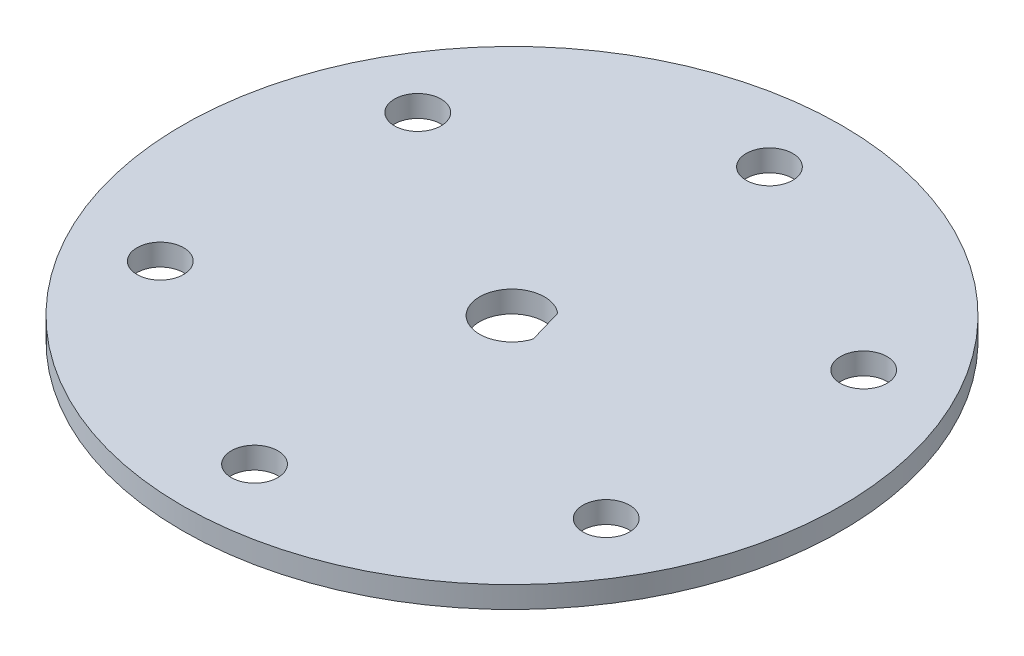
ISO-10303-21;
HEADER;
FILE_DESCRIPTION(('STEP AP214'),'2;1');
FILE_NAME('part.step','',(''),(''),'','','');
FILE_SCHEMA(('AUTOMOTIVE_DESIGN { 1 0 10303 214 1 1 1 1 }'));
ENDSEC;
DATA;
#1=APPLICATION_CONTEXT('core data for automotive mechanical design processes');
#2=APPLICATION_PROTOCOL_DEFINITION('international standard','automotive_design',2000,#1);
#3=PRODUCT_CONTEXT('',#1,'mechanical');
#4=PRODUCT('Part','Part','',(#3));
#5=PRODUCT_RELATED_PRODUCT_CATEGORY('part','',(#4));
#6=PRODUCT_DEFINITION_FORMATION('','',#4);
#7=PRODUCT_DEFINITION_CONTEXT('part definition',#1,'design');
#8=PRODUCT_DEFINITION('design','',#6,#7);
#9=PRODUCT_DEFINITION_SHAPE('','',#8);
#10=(LENGTH_UNIT() NAMED_UNIT(*) SI_UNIT(.MILLI.,.METRE.));
#11=(NAMED_UNIT(*) PLANE_ANGLE_UNIT() SI_UNIT($,.RADIAN.));
#12=(NAMED_UNIT(*) SI_UNIT($,.STERADIAN.) SOLID_ANGLE_UNIT());
#13=UNCERTAINTY_MEASURE_WITH_UNIT(LENGTH_MEASURE(1.E-05),#10,'distance_accuracy_value','');
#14=(GEOMETRIC_REPRESENTATION_CONTEXT(3) GLOBAL_UNCERTAINTY_ASSIGNED_CONTEXT((#13)) GLOBAL_UNIT_ASSIGNED_CONTEXT((#10,
#11,#12)) REPRESENTATION_CONTEXT('',''));
#15=CARTESIAN_POINT('',(0.,0.,0.));
#16=DIRECTION('',(0.,0.,1.));
#17=DIRECTION('',(1.,0.,0.));
#18=AXIS2_PLACEMENT_3D('',#15,#16,#17);
#19=CARTESIAN_POINT('',(0.,2.,0.));
#20=DIRECTION('',(0.,1.,0.));
#21=DIRECTION('',(0.,0.,1.));
#22=AXIS2_PLACEMENT_3D('',#19,#20,#21);
#23=PLANE('',#22);
#24=DIRECTION('',(-0.280870271353728,0.,-0.95974574272027));
#25=VECTOR('',#24,1.);
#26=CARTESIAN_POINT('',(2.39828920067989,2.,-0.701861033184085));
#27=LINE('',#26,#25);
#28=CARTESIAN_POINT('',(2.86453385112708,2.,0.891316899731563));
#29=VERTEX_POINT('',#28);
#30=CARTESIAN_POINT('',(1.9320445502327,2.,-2.29503896609973));
#31=VERTEX_POINT('',#30);
#32=EDGE_CURVE('E50',#29,#31,#27,.T.);
#33=ORIENTED_EDGE('',*,*,#32,.F.);
#34=CARTESIAN_POINT('',(0.,2.,0.));
#35=DIRECTION('',(0.,1.,0.));
#36=DIRECTION('',(0.,0.,1.));
#37=AXIS2_PLACEMENT_3D('',#34,#35,#36);
#38=CIRCLE('',#37,3.);
#39=EDGE_CURVE('E68',#31,#29,#38,.T.);
#40=ORIENTED_EDGE('',*,*,#39,.F.);
#41=EDGE_LOOP('',(#33,#40));
#42=FACE_BOUND('',#41,.T.);
#43=CARTESIAN_POINT('',(-20.6222299276169,2.,-11.90625));
#44=DIRECTION('',(0.,1.,0.));
#45=DIRECTION('',(0.,0.,1.));
#46=AXIS2_PLACEMENT_3D('',#43,#44,#45);
#47=CIRCLE('',#46,2.15265);
#48=CARTESIAN_POINT('',(-20.6222299276169,2.,-9.7536));
#49=VERTEX_POINT('',#48);
#50=EDGE_CURVE('E82',#49,#49,#47,.T.);
#51=ORIENTED_EDGE('',*,*,#50,.F.);
#52=EDGE_LOOP('',(#51));
#53=FACE_BOUND('',#52,.T.);
#54=CARTESIAN_POINT('',(20.6222299276168,2.,-11.9062500000002));
#55=DIRECTION('',(0.,1.,0.));
#56=DIRECTION('',(0.,0.,1.));
#57=AXIS2_PLACEMENT_3D('',#54,#55,#56);
#58=CIRCLE('',#57,2.15265);
#59=CARTESIAN_POINT('',(20.6222299276168,2.,-9.75360000000024));
#60=VERTEX_POINT('',#59);
#61=EDGE_CURVE('E94',#60,#60,#58,.T.);
#62=ORIENTED_EDGE('',*,*,#61,.F.);
#63=EDGE_LOOP('',(#62));
#64=FACE_BOUND('',#63,.T.);
#65=CARTESIAN_POINT('',(0.,2.,23.8125));
#66=DIRECTION('',(0.,1.,0.));
#67=DIRECTION('',(0.,0.,1.));
#68=AXIS2_PLACEMENT_3D('',#65,#66,#67);
#69=CIRCLE('',#68,2.15265);
#70=CARTESIAN_POINT('',(0.,2.,25.96515));
#71=VERTEX_POINT('',#70);
#72=EDGE_CURVE('E106',#71,#71,#69,.T.);
#73=ORIENTED_EDGE('',*,*,#72,.F.);
#74=EDGE_LOOP('',(#73));
#75=FACE_BOUND('',#74,.T.);
#76=CARTESIAN_POINT('',(0.,2.,0.));
#77=DIRECTION('',(0.,1.,0.));
#78=DIRECTION('',(0.,0.,1.));
#79=AXIS2_PLACEMENT_3D('',#76,#77,#78);
#80=CIRCLE('',#79,30.48);
#81=CARTESIAN_POINT('',(0.,2.,30.48));
#82=VERTEX_POINT('',#81);
#83=EDGE_CURVE('E112',#82,#82,#80,.T.);
#84=ORIENTED_EDGE('',*,*,#83,.T.);
#85=EDGE_LOOP('',(#84));
#86=FACE_BOUND('',#85,.T.);
#87=CARTESIAN_POINT('',(20.622229927617,2.,11.9062499999998));
#88=DIRECTION('',(0.,1.,0.));
#89=DIRECTION('',(0.,0.,1.));
#90=AXIS2_PLACEMENT_3D('',#87,#88,#89);
#91=CIRCLE('',#90,2.15265);
#92=CARTESIAN_POINT('',(20.622229927617,2.,14.0588999999998));
#93=VERTEX_POINT('',#92);
#94=EDGE_CURVE('E100',#93,#93,#91,.T.);
#95=ORIENTED_EDGE('',*,*,#94,.F.);
#96=EDGE_LOOP('',(#95));
#97=FACE_BOUND('',#96,.T.);
#98=CARTESIAN_POINT('',(0.,2.,-23.8125));
#99=DIRECTION('',(0.,1.,0.));
#100=DIRECTION('',(0.,0.,1.));
#101=AXIS2_PLACEMENT_3D('',#98,#99,#100);
#102=CIRCLE('',#101,2.15265);
#103=CARTESIAN_POINT('',(0.,2.,-21.65985));
#104=VERTEX_POINT('',#103);
#105=EDGE_CURVE('E88',#104,#104,#102,.T.);
#106=ORIENTED_EDGE('',*,*,#105,.F.);
#107=EDGE_LOOP('',(#106));
#108=FACE_BOUND('',#107,.T.);
#109=CARTESIAN_POINT('',(-20.6222299276169,2.,11.90625));
#110=DIRECTION('',(0.,1.,0.));
#111=DIRECTION('',(0.,0.,1.));
#112=AXIS2_PLACEMENT_3D('',#109,#110,#111);
#113=CIRCLE('',#112,2.15265);
#114=CARTESIAN_POINT('',(-20.6222299276169,2.,14.0589));
#115=VERTEX_POINT('',#114);
#116=EDGE_CURVE('E76',#115,#115,#113,.T.);
#117=ORIENTED_EDGE('',*,*,#116,.F.);
#118=EDGE_LOOP('',(#117));
#119=FACE_BOUND('',#118,.T.);
#120=ADVANCED_FACE('F35',(#42,#53,#64,#75,#86,#97,#108,#119),#23,.T.);
#121=CARTESIAN_POINT('',(0.,0.,0.));
#122=DIRECTION('',(0.,1.,0.));
#123=DIRECTION('',(0.,0.,1.));
#124=AXIS2_PLACEMENT_3D('',#121,#122,#123);
#125=PLANE('',#124);
#126=CARTESIAN_POINT('',(0.,0.,0.));
#127=DIRECTION('',(0.,1.,0.));
#128=DIRECTION('',(0.,0.,1.));
#129=AXIS2_PLACEMENT_3D('',#126,#127,#128);
#130=CIRCLE('',#129,3.);
#131=CARTESIAN_POINT('',(1.9320445502327,0.,-2.29503896609973));
#132=VERTEX_POINT('',#131);
#133=CARTESIAN_POINT('',(2.86453385112708,0.,0.891316899731563));
#134=VERTEX_POINT('',#133);
#135=EDGE_CURVE('E43',#132,#134,#130,.T.);
#136=ORIENTED_EDGE('',*,*,#135,.T.);
#137=DIRECTION('',(-0.280870271353728,0.,-0.95974574272027));
#138=VECTOR('',#137,1.);
#139=CARTESIAN_POINT('',(2.39828920067989,0.,-0.701861033184085));
#140=LINE('',#139,#138);
#141=EDGE_CURVE('E11',#134,#132,#140,.T.);
#142=ORIENTED_EDGE('',*,*,#141,.T.);
#143=EDGE_LOOP('',(#136,#142));
#144=FACE_BOUND('',#143,.T.);
#145=CARTESIAN_POINT('',(0.,0.,0.));
#146=DIRECTION('',(0.,1.,0.));
#147=DIRECTION('',(0.,0.,1.));
#148=AXIS2_PLACEMENT_3D('',#145,#146,#147);
#149=CIRCLE('',#148,30.48);
#150=CARTESIAN_POINT('',(0.,0.,30.48));
#151=VERTEX_POINT('',#150);
#152=EDGE_CURVE('E109',#151,#151,#149,.T.);
#153=ORIENTED_EDGE('',*,*,#152,.F.);
#154=EDGE_LOOP('',(#153));
#155=FACE_BOUND('',#154,.T.);
#156=CARTESIAN_POINT('',(0.,0.,23.8125));
#157=DIRECTION('',(0.,1.,0.));
#158=DIRECTION('',(0.,0.,1.));
#159=AXIS2_PLACEMENT_3D('',#156,#157,#158);
#160=CIRCLE('',#159,2.15265);
#161=CARTESIAN_POINT('',(0.,0.,25.96515));
#162=VERTEX_POINT('',#161);
#163=EDGE_CURVE('E103',#162,#162,#160,.T.);
#164=ORIENTED_EDGE('',*,*,#163,.T.);
#165=EDGE_LOOP('',(#164));
#166=FACE_BOUND('',#165,.T.);
#167=CARTESIAN_POINT('',(20.622229927617,0.,11.9062499999998));
#168=DIRECTION('',(0.,1.,0.));
#169=DIRECTION('',(0.,0.,1.));
#170=AXIS2_PLACEMENT_3D('',#167,#168,#169);
#171=CIRCLE('',#170,2.15265);
#172=CARTESIAN_POINT('',(20.622229927617,0.,14.0588999999998));
#173=VERTEX_POINT('',#172);
#174=EDGE_CURVE('E97',#173,#173,#171,.T.);
#175=ORIENTED_EDGE('',*,*,#174,.T.);
#176=EDGE_LOOP('',(#175));
#177=FACE_BOUND('',#176,.T.);
#178=CARTESIAN_POINT('',(20.6222299276168,0.,-11.9062500000002));
#179=DIRECTION('',(0.,1.,0.));
#180=DIRECTION('',(0.,0.,1.));
#181=AXIS2_PLACEMENT_3D('',#178,#179,#180);
#182=CIRCLE('',#181,2.15265);
#183=CARTESIAN_POINT('',(20.6222299276168,0.,-9.75360000000024));
#184=VERTEX_POINT('',#183);
#185=EDGE_CURVE('E91',#184,#184,#182,.T.);
#186=ORIENTED_EDGE('',*,*,#185,.T.);
#187=EDGE_LOOP('',(#186));
#188=FACE_BOUND('',#187,.T.);
#189=CARTESIAN_POINT('',(0.,0.,-23.8125));
#190=DIRECTION('',(0.,1.,0.));
#191=DIRECTION('',(0.,0.,1.));
#192=AXIS2_PLACEMENT_3D('',#189,#190,#191);
#193=CIRCLE('',#192,2.15265);
#194=CARTESIAN_POINT('',(0.,0.,-21.65985));
#195=VERTEX_POINT('',#194);
#196=EDGE_CURVE('E85',#195,#195,#193,.T.);
#197=ORIENTED_EDGE('',*,*,#196,.T.);
#198=EDGE_LOOP('',(#197));
#199=FACE_BOUND('',#198,.T.);
#200=CARTESIAN_POINT('',(-20.6222299276169,0.,-11.90625));
#201=DIRECTION('',(0.,1.,0.));
#202=DIRECTION('',(0.,0.,1.));
#203=AXIS2_PLACEMENT_3D('',#200,#201,#202);
#204=CIRCLE('',#203,2.15265);
#205=CARTESIAN_POINT('',(-20.6222299276169,0.,-9.7536));
#206=VERTEX_POINT('',#205);
#207=EDGE_CURVE('E79',#206,#206,#204,.T.);
#208=ORIENTED_EDGE('',*,*,#207,.T.);
#209=EDGE_LOOP('',(#208));
#210=FACE_BOUND('',#209,.T.);
#211=CARTESIAN_POINT('',(-20.6222299276169,0.,11.90625));
#212=DIRECTION('',(0.,1.,0.));
#213=DIRECTION('',(0.,0.,1.));
#214=AXIS2_PLACEMENT_3D('',#211,#212,#213);
#215=CIRCLE('',#214,2.15265);
#216=CARTESIAN_POINT('',(-20.6222299276169,0.,14.0589));
#217=VERTEX_POINT('',#216);
#218=EDGE_CURVE('E64',#217,#217,#215,.T.);
#219=ORIENTED_EDGE('',*,*,#218,.T.);
#220=EDGE_LOOP('',(#219));
#221=FACE_BOUND('',#220,.T.);
#222=ADVANCED_FACE('F117',(#144,#155,#166,#177,#188,#199,#210,#221),#125,.F.);
#223=CARTESIAN_POINT('',(0.,2.,0.));
#224=DIRECTION('',(0.,-1.,0.));
#225=DIRECTION('',(0.,0.,-1.));
#226=AXIS2_PLACEMENT_3D('',#223,#224,#225);
#227=CYLINDRICAL_SURFACE('',#226,30.48);
#228=ORIENTED_EDGE('',*,*,#83,.F.);
#229=EDGE_LOOP('',(#228));
#230=FACE_BOUND('',#229,.T.);
#231=ORIENTED_EDGE('',*,*,#152,.T.);
#232=EDGE_LOOP('',(#231));
#233=FACE_BOUND('',#232,.T.);
#234=ADVANCED_FACE('F37',(#230,#233),#227,.T.);
#235=CARTESIAN_POINT('',(0.,2.,23.8125));
#236=DIRECTION('',(0.,-1.,0.));
#237=DIRECTION('',(0.,0.,-1.));
#238=AXIS2_PLACEMENT_3D('',#235,#236,#237);
#239=CYLINDRICAL_SURFACE('',#238,2.15265);
#240=ORIENTED_EDGE('',*,*,#72,.T.);
#241=EDGE_LOOP('',(#240));
#242=FACE_BOUND('',#241,.T.);
#243=ORIENTED_EDGE('',*,*,#163,.F.);
#244=EDGE_LOOP('',(#243));
#245=FACE_BOUND('',#244,.T.);
#246=ADVANCED_FACE('F152',(#242,#245),#239,.F.);
#247=CARTESIAN_POINT('',(20.622229927617,2.,11.9062499999998));
#248=DIRECTION('',(0.,-1.,0.));
#249=DIRECTION('',(0.,0.,-1.));
#250=AXIS2_PLACEMENT_3D('',#247,#248,#249);
#251=CYLINDRICAL_SURFACE('',#250,2.15265);
#252=ORIENTED_EDGE('',*,*,#94,.T.);
#253=EDGE_LOOP('',(#252));
#254=FACE_BOUND('',#253,.T.);
#255=ORIENTED_EDGE('',*,*,#174,.F.);
#256=EDGE_LOOP('',(#255));
#257=FACE_BOUND('',#256,.T.);
#258=ADVANCED_FACE('F155',(#254,#257),#251,.F.);
#259=CARTESIAN_POINT('',(20.6222299276168,2.,-11.9062500000002));
#260=DIRECTION('',(0.,-1.,0.));
#261=DIRECTION('',(0.,0.,-1.));
#262=AXIS2_PLACEMENT_3D('',#259,#260,#261);
#263=CYLINDRICAL_SURFACE('',#262,2.15265);
#264=ORIENTED_EDGE('',*,*,#61,.T.);
#265=EDGE_LOOP('',(#264));
#266=FACE_BOUND('',#265,.T.);
#267=ORIENTED_EDGE('',*,*,#185,.F.);
#268=EDGE_LOOP('',(#267));
#269=FACE_BOUND('',#268,.T.);
#270=ADVANCED_FACE('F159',(#266,#269),#263,.F.);
#271=CARTESIAN_POINT('',(0.,2.,-23.8125));
#272=DIRECTION('',(0.,-1.,0.));
#273=DIRECTION('',(0.,0.,-1.));
#274=AXIS2_PLACEMENT_3D('',#271,#272,#273);
#275=CYLINDRICAL_SURFACE('',#274,2.15265);
#276=ORIENTED_EDGE('',*,*,#105,.T.);
#277=EDGE_LOOP('',(#276));
#278=FACE_BOUND('',#277,.T.);
#279=ORIENTED_EDGE('',*,*,#196,.F.);
#280=EDGE_LOOP('',(#279));
#281=FACE_BOUND('',#280,.T.);
#282=ADVANCED_FACE('F144',(#278,#281),#275,.F.);
#283=CARTESIAN_POINT('',(-20.6222299276169,2.,-11.90625));
#284=DIRECTION('',(0.,-1.,0.));
#285=DIRECTION('',(0.,0.,-1.));
#286=AXIS2_PLACEMENT_3D('',#283,#284,#285);
#287=CYLINDRICAL_SURFACE('',#286,2.15265);
#288=ORIENTED_EDGE('',*,*,#50,.T.);
#289=EDGE_LOOP('',(#288));
#290=FACE_BOUND('',#289,.T.);
#291=ORIENTED_EDGE('',*,*,#207,.F.);
#292=EDGE_LOOP('',(#291));
#293=FACE_BOUND('',#292,.T.);
#294=ADVANCED_FACE('F136',(#290,#293),#287,.F.);
#295=CARTESIAN_POINT('',(-20.6222299276169,2.,11.90625));
#296=DIRECTION('',(0.,-1.,0.));
#297=DIRECTION('',(0.,0.,-1.));
#298=AXIS2_PLACEMENT_3D('',#295,#296,#297);
#299=CYLINDRICAL_SURFACE('',#298,2.15265);
#300=ORIENTED_EDGE('',*,*,#116,.T.);
#301=EDGE_LOOP('',(#300));
#302=FACE_BOUND('',#301,.T.);
#303=ORIENTED_EDGE('',*,*,#218,.F.);
#304=EDGE_LOOP('',(#303));
#305=FACE_BOUND('',#304,.T.);
#306=ADVANCED_FACE('F134',(#302,#305),#299,.F.);
#307=CARTESIAN_POINT('',(2.39828920067989,-8.,-0.701861033184085));
#308=DIRECTION('',(0.95974574272027,0.,-0.280870271353728));
#309=DIRECTION('',(-0.280870271353728,0.,-0.95974574272027));
#310=AXIS2_PLACEMENT_3D('',#307,#308,#309);
#311=PLANE('',#310);
#312=DIRECTION('',(0.,1.,0.));
#313=VECTOR('',#312,1.);
#314=CARTESIAN_POINT('',(2.86453385112708,-8.,0.891316899731563));
#315=LINE('',#314,#313);
#316=EDGE_CURVE('E57',#134,#29,#315,.T.);
#317=ORIENTED_EDGE('',*,*,#316,.T.);
#318=ORIENTED_EDGE('',*,*,#32,.T.);
#319=DIRECTION('',(0.,1.,0.));
#320=VECTOR('',#319,1.);
#321=CARTESIAN_POINT('',(1.9320445502327,-8.,-2.29503896609973));
#322=LINE('',#321,#320);
#323=EDGE_CURVE('E65',#132,#31,#322,.T.);
#324=ORIENTED_EDGE('',*,*,#323,.F.);
#325=ORIENTED_EDGE('',*,*,#141,.F.);
#326=EDGE_LOOP('',(#317,#318,#324,#325));
#327=FACE_BOUND('',#326,.T.);
#328=ADVANCED_FACE('F62',(#327),#311,.F.);
#329=CARTESIAN_POINT('',(0.,-8.,0.));
#330=DIRECTION('',(0.,1.,0.));
#331=DIRECTION('',(0.,0.,1.));
#332=AXIS2_PLACEMENT_3D('',#329,#330,#331);
#333=CYLINDRICAL_SURFACE('',#332,3.);
#334=ORIENTED_EDGE('',*,*,#323,.T.);
#335=ORIENTED_EDGE('',*,*,#39,.T.);
#336=ORIENTED_EDGE('',*,*,#316,.F.);
#337=ORIENTED_EDGE('',*,*,#135,.F.);
#338=EDGE_LOOP('',(#334,#335,#336,#337));
#339=FACE_BOUND('',#338,.T.);
#340=ADVANCED_FACE('F69',(#339),#333,.F.);
#341=CLOSED_SHELL('',(#120,#222,#234,#246,#258,#270,#282,#294,#306,#328,#340));
#342=MANIFOLD_SOLID_BREP('B2',#341);
#343=ADVANCED_BREP_SHAPE_REPRESENTATION('',(#18,#342),#14);
#344=SHAPE_DEFINITION_REPRESENTATION(#9,#343);
ENDSEC;
END-ISO-10303-21;
